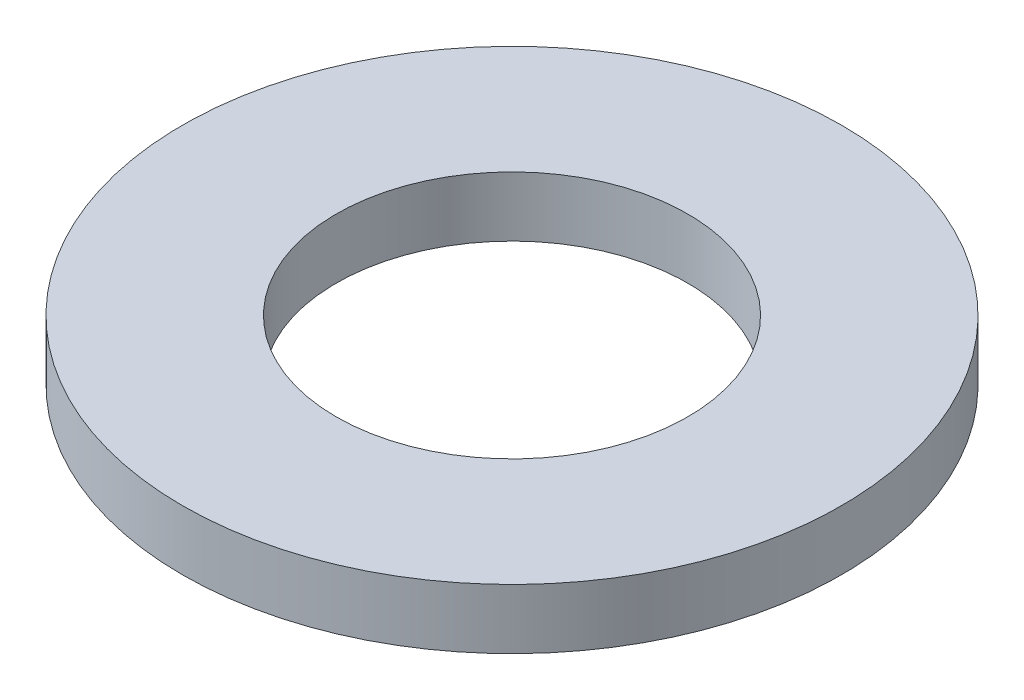
ISO-10303-21;
HEADER;
FILE_DESCRIPTION(('STEP AP214'),'2;1');
FILE_NAME('part.step','',(''),(''),'','','');
FILE_SCHEMA(('AUTOMOTIVE_DESIGN { 1 0 10303 214 1 1 1 1 }'));
ENDSEC;
DATA;
#1=APPLICATION_CONTEXT('core data for automotive mechanical design processes');
#2=APPLICATION_PROTOCOL_DEFINITION('international standard','automotive_design',2000,#1);
#3=PRODUCT_CONTEXT('',#1,'mechanical');
#4=PRODUCT('Part','Part','',(#3));
#5=PRODUCT_RELATED_PRODUCT_CATEGORY('part','',(#4));
#6=PRODUCT_DEFINITION_FORMATION('','',#4);
#7=PRODUCT_DEFINITION_CONTEXT('part definition',#1,'design');
#8=PRODUCT_DEFINITION('design','',#6,#7);
#9=PRODUCT_DEFINITION_SHAPE('','',#8);
#10=(LENGTH_UNIT() NAMED_UNIT(*) SI_UNIT(.MILLI.,.METRE.));
#11=(NAMED_UNIT(*) PLANE_ANGLE_UNIT() SI_UNIT($,.RADIAN.));
#12=(NAMED_UNIT(*) SI_UNIT($,.STERADIAN.) SOLID_ANGLE_UNIT());
#13=UNCERTAINTY_MEASURE_WITH_UNIT(LENGTH_MEASURE(1.E-05),#10,'distance_accuracy_value','');
#14=(GEOMETRIC_REPRESENTATION_CONTEXT(3) GLOBAL_UNCERTAINTY_ASSIGNED_CONTEXT((#13)) GLOBAL_UNIT_ASSIGNED_CONTEXT((#10,
#11,#12)) REPRESENTATION_CONTEXT('',''));
#15=CARTESIAN_POINT('',(0.,0.,0.));
#16=DIRECTION('',(0.,0.,1.));
#17=DIRECTION('',(1.,0.,0.));
#18=AXIS2_PLACEMENT_3D('',#15,#16,#17);
#19=CARTESIAN_POINT('',(-67.8890092982736,1.5,0.));
#20=DIRECTION('',(0.,1.,0.));
#21=DIRECTION('',(0.,0.,1.));
#22=AXIS2_PLACEMENT_3D('',#19,#20,#21);
#23=PLANE('',#22);
#24=CARTESIAN_POINT('',(-67.8890092982736,1.5,0.));
#25=DIRECTION('',(0.,1.,0.));
#26=DIRECTION('',(0.,0.,1.));
#27=AXIS2_PLACEMENT_3D('',#24,#25,#26);
#28=CIRCLE('',#27,8.25);
#29=CARTESIAN_POINT('',(-67.8890092982736,1.5,8.25));
#30=VERTEX_POINT('',#29);
#31=EDGE_CURVE('E10',#30,#30,#28,.T.);
#32=ORIENTED_EDGE('',*,*,#31,.T.);
#33=EDGE_LOOP('',(#32));
#34=FACE_BOUND('',#33,.T.);
#35=CARTESIAN_POINT('',(-67.8890092982736,1.5,0.));
#36=DIRECTION('',(0.,1.,0.));
#37=DIRECTION('',(0.,0.,1.));
#38=AXIS2_PLACEMENT_3D('',#35,#36,#37);
#39=CIRCLE('',#38,4.4);
#40=CARTESIAN_POINT('',(-67.8890092982736,1.5,4.4));
#41=VERTEX_POINT('',#40);
#42=EDGE_CURVE('E44',#41,#41,#39,.T.);
#43=ORIENTED_EDGE('',*,*,#42,.F.);
#44=EDGE_LOOP('',(#43));
#45=FACE_BOUND('',#44,.T.);
#46=ADVANCED_FACE('F33',(#34,#45),#23,.T.);
#47=CARTESIAN_POINT('',(-67.8890092982736,0.,0.));
#48=DIRECTION('',(0.,1.,0.));
#49=DIRECTION('',(0.,0.,1.));
#50=AXIS2_PLACEMENT_3D('',#47,#48,#49);
#51=PLANE('',#50);
#52=CARTESIAN_POINT('',(-67.8890092982736,0.,0.));
#53=DIRECTION('',(0.,1.,0.));
#54=DIRECTION('',(0.,0.,1.));
#55=AXIS2_PLACEMENT_3D('',#52,#53,#54);
#56=CIRCLE('',#55,8.25);
#57=CARTESIAN_POINT('',(-67.8890092982736,0.,8.25));
#58=VERTEX_POINT('',#57);
#59=EDGE_CURVE('E37',#58,#58,#56,.T.);
#60=ORIENTED_EDGE('',*,*,#59,.F.);
#61=EDGE_LOOP('',(#60));
#62=FACE_BOUND('',#61,.T.);
#63=CARTESIAN_POINT('',(-67.8890092982736,0.,0.));
#64=DIRECTION('',(0.,1.,0.));
#65=DIRECTION('',(0.,0.,1.));
#66=AXIS2_PLACEMENT_3D('',#63,#64,#65);
#67=CIRCLE('',#66,4.4);
#68=CARTESIAN_POINT('',(-67.8890092982736,0.,4.4));
#69=VERTEX_POINT('',#68);
#70=EDGE_CURVE('E46',#69,#69,#67,.T.);
#71=ORIENTED_EDGE('',*,*,#70,.T.);
#72=EDGE_LOOP('',(#71));
#73=FACE_BOUND('',#72,.T.);
#74=ADVANCED_FACE('F56',(#62,#73),#51,.F.);
#75=CARTESIAN_POINT('',(-67.8890092982736,1.5,0.));
#76=DIRECTION('',(0.,-1.,0.));
#77=DIRECTION('',(0.,0.,-1.));
#78=AXIS2_PLACEMENT_3D('',#75,#76,#77);
#79=CYLINDRICAL_SURFACE('',#78,8.25);
#80=ORIENTED_EDGE('',*,*,#31,.F.);
#81=EDGE_LOOP('',(#80));
#82=FACE_BOUND('',#81,.T.);
#83=ORIENTED_EDGE('',*,*,#59,.T.);
#84=EDGE_LOOP('',(#83));
#85=FACE_BOUND('',#84,.T.);
#86=ADVANCED_FACE('F35',(#82,#85),#79,.T.);
#87=CARTESIAN_POINT('',(-67.8890092982736,1.5,0.));
#88=DIRECTION('',(0.,-1.,0.));
#89=DIRECTION('',(0.,0.,-1.));
#90=AXIS2_PLACEMENT_3D('',#87,#88,#89);
#91=CYLINDRICAL_SURFACE('',#90,4.4);
#92=ORIENTED_EDGE('',*,*,#42,.T.);
#93=EDGE_LOOP('',(#92));
#94=FACE_BOUND('',#93,.T.);
#95=ORIENTED_EDGE('',*,*,#70,.F.);
#96=EDGE_LOOP('',(#95));
#97=FACE_BOUND('',#96,.T.);
#98=ADVANCED_FACE('F52',(#94,#97),#91,.F.);
#99=CLOSED_SHELL('',(#46,#74,#86,#98));
#100=MANIFOLD_SOLID_BREP('B2',#99);
#101=ADVANCED_BREP_SHAPE_REPRESENTATION('',(#18,#100),#14);
#102=SHAPE_DEFINITION_REPRESENTATION(#9,#101);
ENDSEC;
END-ISO-10303-21;
